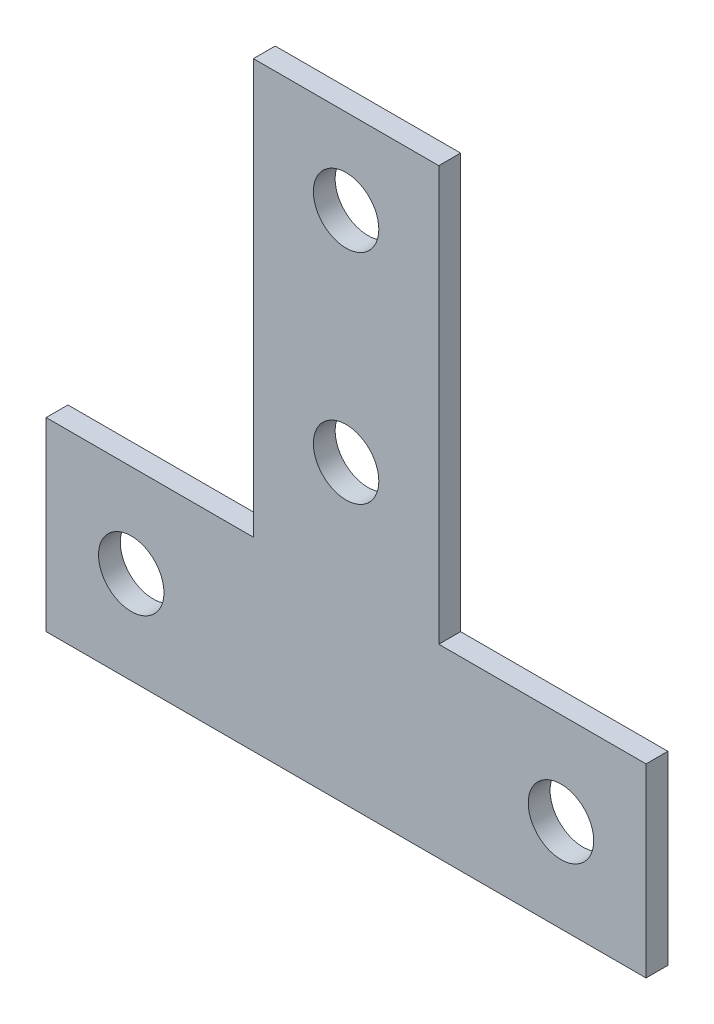
ISO-10303-21;
HEADER;
FILE_DESCRIPTION(('STEP AP214'),'2;1');
FILE_NAME('part.step','',(''),(''),'','','');
FILE_SCHEMA(('AUTOMOTIVE_DESIGN { 1 0 10303 214 1 1 1 1 }'));
ENDSEC;
DATA;
#1=APPLICATION_CONTEXT('core data for automotive mechanical design processes');
#2=APPLICATION_PROTOCOL_DEFINITION('international standard','automotive_design',2000,#1);
#3=PRODUCT_CONTEXT('',#1,'mechanical');
#4=PRODUCT('Part','Part','',(#3));
#5=PRODUCT_RELATED_PRODUCT_CATEGORY('part','',(#4));
#6=PRODUCT_DEFINITION_FORMATION('','',#4);
#7=PRODUCT_DEFINITION_CONTEXT('part definition',#1,'design');
#8=PRODUCT_DEFINITION('design','',#6,#7);
#9=PRODUCT_DEFINITION_SHAPE('','',#8);
#10=(LENGTH_UNIT() NAMED_UNIT(*) SI_UNIT(.MILLI.,.METRE.));
#11=(NAMED_UNIT(*) PLANE_ANGLE_UNIT() SI_UNIT($,.RADIAN.));
#12=(NAMED_UNIT(*) SI_UNIT($,.STERADIAN.) SOLID_ANGLE_UNIT());
#13=UNCERTAINTY_MEASURE_WITH_UNIT(LENGTH_MEASURE(1.E-05),#10,'distance_accuracy_value','');
#14=(GEOMETRIC_REPRESENTATION_CONTEXT(3) GLOBAL_UNCERTAINTY_ASSIGNED_CONTEXT((#13)) GLOBAL_UNIT_ASSIGNED_CONTEXT((#10,
#11,#12)) REPRESENTATION_CONTEXT('',''));
#15=CARTESIAN_POINT('',(0.,0.,0.));
#16=DIRECTION('',(0.,0.,1.));
#17=DIRECTION('',(1.,0.,0.));
#18=AXIS2_PLACEMENT_3D('',#15,#16,#17);
#19=CARTESIAN_POINT('',(8.5,8.5,2.));
#20=DIRECTION('',(0.,-1.,0.));
#21=DIRECTION('',(0.,0.,-1.));
#22=AXIS2_PLACEMENT_3D('',#19,#20,#21);
#23=PLANE('',#22);
#24=DIRECTION('',(-1.,0.,0.));
#25=VECTOR('',#24,1.);
#26=CARTESIAN_POINT('',(8.5,8.5,0.));
#27=LINE('',#26,#25);
#28=CARTESIAN_POINT('',(27.5,8.5,0.));
#29=VERTEX_POINT('',#28);
#30=CARTESIAN_POINT('',(8.5,8.5,0.));
#31=VERTEX_POINT('',#30);
#32=EDGE_CURVE('E129',#29,#31,#27,.T.);
#33=ORIENTED_EDGE('',*,*,#32,.T.);
#34=DIRECTION('',(0.,0.,-1.));
#35=VECTOR('',#34,1.);
#36=CARTESIAN_POINT('',(8.5,8.5,2.));
#37=LINE('',#36,#35);
#38=CARTESIAN_POINT('',(8.5,8.5,2.));
#39=VERTEX_POINT('',#38);
#40=EDGE_CURVE('E11',#39,#31,#37,.T.);
#41=ORIENTED_EDGE('',*,*,#40,.F.);
#42=DIRECTION('',(-1.,0.,0.));
#43=VECTOR('',#42,1.);
#44=CARTESIAN_POINT('',(8.5,8.5,2.));
#45=LINE('',#44,#43);
#46=CARTESIAN_POINT('',(27.5,8.5,2.));
#47=VERTEX_POINT('',#46);
#48=EDGE_CURVE('E144',#47,#39,#45,.T.);
#49=ORIENTED_EDGE('',*,*,#48,.F.);
#50=DIRECTION('',(0.,0.,-1.));
#51=VECTOR('',#50,1.);
#52=CARTESIAN_POINT('',(27.5,8.5,2.));
#53=LINE('',#52,#51);
#54=EDGE_CURVE('E125',#47,#29,#53,.T.);
#55=ORIENTED_EDGE('',*,*,#54,.T.);
#56=EDGE_LOOP('',(#33,#41,#49,#55));
#57=FACE_BOUND('',#56,.T.);
#58=ADVANCED_FACE('F33',(#57),#23,.F.);
#59=CARTESIAN_POINT('',(8.5,8.5,2.));
#60=DIRECTION('',(-1.,0.,0.));
#61=DIRECTION('',(0.,0.,1.));
#62=AXIS2_PLACEMENT_3D('',#59,#60,#61);
#63=PLANE('',#62);
#64=DIRECTION('',(0.,1.,0.));
#65=VECTOR('',#64,1.);
#66=CARTESIAN_POINT('',(8.5,8.5,0.));
#67=LINE('',#66,#65);
#68=CARTESIAN_POINT('',(8.5,46.5,0.));
#69=VERTEX_POINT('',#68);
#70=EDGE_CURVE('E132',#31,#69,#67,.T.);
#71=ORIENTED_EDGE('',*,*,#70,.T.);
#72=DIRECTION('',(0.,0.,-1.));
#73=VECTOR('',#72,1.);
#74=CARTESIAN_POINT('',(8.5,46.5,2.));
#75=LINE('',#74,#73);
#76=CARTESIAN_POINT('',(8.5,46.5,2.));
#77=VERTEX_POINT('',#76);
#78=EDGE_CURVE('E41',#77,#69,#75,.T.);
#79=ORIENTED_EDGE('',*,*,#78,.F.);
#80=DIRECTION('',(0.,1.,0.));
#81=VECTOR('',#80,1.);
#82=CARTESIAN_POINT('',(8.5,8.5,2.));
#83=LINE('',#82,#81);
#84=EDGE_CURVE('E92',#39,#77,#83,.T.);
#85=ORIENTED_EDGE('',*,*,#84,.F.);
#86=ORIENTED_EDGE('',*,*,#40,.T.);
#87=EDGE_LOOP('',(#71,#79,#85,#86));
#88=FACE_BOUND('',#87,.T.);
#89=ADVANCED_FACE('F234',(#88),#63,.F.);
#90=CARTESIAN_POINT('',(-8.5,46.5,2.));
#91=DIRECTION('',(0.,-1.,0.));
#92=DIRECTION('',(0.,0.,-1.));
#93=AXIS2_PLACEMENT_3D('',#90,#91,#92);
#94=PLANE('',#93);
#95=DIRECTION('',(-1.,0.,0.));
#96=VECTOR('',#95,1.);
#97=CARTESIAN_POINT('',(-8.5,46.5,0.));
#98=LINE('',#97,#96);
#99=CARTESIAN_POINT('',(-8.5,46.5,0.));
#100=VERTEX_POINT('',#99);
#101=EDGE_CURVE('E135',#69,#100,#98,.T.);
#102=ORIENTED_EDGE('',*,*,#101,.T.);
#103=DIRECTION('',(0.,0.,-1.));
#104=VECTOR('',#103,1.);
#105=CARTESIAN_POINT('',(-8.5,46.5,2.));
#106=LINE('',#105,#104);
#107=CARTESIAN_POINT('',(-8.5,46.5,2.));
#108=VERTEX_POINT('',#107);
#109=EDGE_CURVE('E151',#108,#100,#106,.T.);
#110=ORIENTED_EDGE('',*,*,#109,.F.);
#111=DIRECTION('',(-1.,0.,0.));
#112=VECTOR('',#111,1.);
#113=CARTESIAN_POINT('',(-8.5,46.5,2.));
#114=LINE('',#113,#112);
#115=EDGE_CURVE('E159',#77,#108,#114,.T.);
#116=ORIENTED_EDGE('',*,*,#115,.F.);
#117=ORIENTED_EDGE('',*,*,#78,.T.);
#118=EDGE_LOOP('',(#102,#110,#116,#117));
#119=FACE_BOUND('',#118,.T.);
#120=ADVANCED_FACE('F157',(#119),#94,.F.);
#121=CARTESIAN_POINT('',(-8.5,8.5,2.));
#122=DIRECTION('',(1.,0.,0.));
#123=DIRECTION('',(0.,0.,-1.));
#124=AXIS2_PLACEMENT_3D('',#121,#122,#123);
#125=PLANE('',#124);
#126=DIRECTION('',(0.,-1.,0.));
#127=VECTOR('',#126,1.);
#128=CARTESIAN_POINT('',(-8.5,8.5,0.));
#129=LINE('',#128,#127);
#130=CARTESIAN_POINT('',(-8.5,8.5,0.));
#131=VERTEX_POINT('',#130);
#132=EDGE_CURVE('E137',#100,#131,#129,.T.);
#133=ORIENTED_EDGE('',*,*,#132,.T.);
#134=DIRECTION('',(0.,0.,-1.));
#135=VECTOR('',#134,1.);
#136=CARTESIAN_POINT('',(-8.5,8.5,2.));
#137=LINE('',#136,#135);
#138=CARTESIAN_POINT('',(-8.5,8.5,2.));
#139=VERTEX_POINT('',#138);
#140=EDGE_CURVE('E148',#139,#131,#137,.T.);
#141=ORIENTED_EDGE('',*,*,#140,.F.);
#142=DIRECTION('',(0.,-1.,0.));
#143=VECTOR('',#142,1.);
#144=CARTESIAN_POINT('',(-8.5,8.5,2.));
#145=LINE('',#144,#143);
#146=EDGE_CURVE('E171',#108,#139,#145,.T.);
#147=ORIENTED_EDGE('',*,*,#146,.F.);
#148=ORIENTED_EDGE('',*,*,#109,.T.);
#149=EDGE_LOOP('',(#133,#141,#147,#148));
#150=FACE_BOUND('',#149,.T.);
#151=ADVANCED_FACE('F167',(#150),#125,.F.);
#152=CARTESIAN_POINT('',(-27.5,8.5,2.));
#153=DIRECTION('',(0.,-1.,0.));
#154=DIRECTION('',(0.,0.,-1.));
#155=AXIS2_PLACEMENT_3D('',#152,#153,#154);
#156=PLANE('',#155);
#157=DIRECTION('',(-1.,0.,0.));
#158=VECTOR('',#157,1.);
#159=CARTESIAN_POINT('',(-27.5,8.5,0.));
#160=LINE('',#159,#158);
#161=CARTESIAN_POINT('',(-27.5,8.5,0.));
#162=VERTEX_POINT('',#161);
#163=EDGE_CURVE('E139',#131,#162,#160,.T.);
#164=ORIENTED_EDGE('',*,*,#163,.T.);
#165=DIRECTION('',(0.,0.,-1.));
#166=VECTOR('',#165,1.);
#167=CARTESIAN_POINT('',(-27.5,8.5,2.));
#168=LINE('',#167,#166);
#169=CARTESIAN_POINT('',(-27.5,8.5,2.));
#170=VERTEX_POINT('',#169);
#171=EDGE_CURVE('E120',#170,#162,#168,.T.);
#172=ORIENTED_EDGE('',*,*,#171,.F.);
#173=DIRECTION('',(-1.,0.,0.));
#174=VECTOR('',#173,1.);
#175=CARTESIAN_POINT('',(-27.5,8.5,2.));
#176=LINE('',#175,#174);
#177=EDGE_CURVE('E111',#139,#170,#176,.T.);
#178=ORIENTED_EDGE('',*,*,#177,.F.);
#179=ORIENTED_EDGE('',*,*,#140,.T.);
#180=EDGE_LOOP('',(#164,#172,#178,#179));
#181=FACE_BOUND('',#180,.T.);
#182=ADVANCED_FACE('F170',(#181),#156,.F.);
#183=CARTESIAN_POINT('',(-27.5,-8.5,2.));
#184=DIRECTION('',(1.,0.,0.));
#185=DIRECTION('',(0.,0.,-1.));
#186=AXIS2_PLACEMENT_3D('',#183,#184,#185);
#187=PLANE('',#186);
#188=DIRECTION('',(0.,-1.,0.));
#189=VECTOR('',#188,1.);
#190=CARTESIAN_POINT('',(-27.5,-8.5,0.));
#191=LINE('',#190,#189);
#192=CARTESIAN_POINT('',(-27.5,-8.5,0.));
#193=VERTEX_POINT('',#192);
#194=EDGE_CURVE('E119',#162,#193,#191,.T.);
#195=ORIENTED_EDGE('',*,*,#194,.T.);
#196=DIRECTION('',(0.,0.,-1.));
#197=VECTOR('',#196,1.);
#198=CARTESIAN_POINT('',(-27.5,-8.5,2.));
#199=LINE('',#198,#197);
#200=CARTESIAN_POINT('',(-27.5,-8.5,2.));
#201=VERTEX_POINT('',#200);
#202=EDGE_CURVE('E116',#201,#193,#199,.T.);
#203=ORIENTED_EDGE('',*,*,#202,.F.);
#204=DIRECTION('',(0.,-1.,0.));
#205=VECTOR('',#204,1.);
#206=CARTESIAN_POINT('',(-27.5,-8.5,2.));
#207=LINE('',#206,#205);
#208=EDGE_CURVE('E105',#170,#201,#207,.T.);
#209=ORIENTED_EDGE('',*,*,#208,.F.);
#210=ORIENTED_EDGE('',*,*,#171,.T.);
#211=EDGE_LOOP('',(#195,#203,#209,#210));
#212=FACE_BOUND('',#211,.T.);
#213=ADVANCED_FACE('F117',(#212),#187,.F.);
#214=CARTESIAN_POINT('',(-27.5,-8.5,2.));
#215=DIRECTION('',(0.,1.,0.));
#216=DIRECTION('',(0.,0.,1.));
#217=AXIS2_PLACEMENT_3D('',#214,#215,#216);
#218=PLANE('',#217);
#219=DIRECTION('',(1.,0.,0.));
#220=VECTOR('',#219,1.);
#221=CARTESIAN_POINT('',(-27.5,-8.5,0.));
#222=LINE('',#221,#220);
#223=CARTESIAN_POINT('',(27.5,-8.5,0.));
#224=VERTEX_POINT('',#223);
#225=EDGE_CURVE('E78',#193,#224,#222,.T.);
#226=ORIENTED_EDGE('',*,*,#225,.T.);
#227=DIRECTION('',(0.,0.,-1.));
#228=VECTOR('',#227,1.);
#229=CARTESIAN_POINT('',(27.5,-8.5,2.));
#230=LINE('',#229,#228);
#231=CARTESIAN_POINT('',(27.5,-8.5,2.));
#232=VERTEX_POINT('',#231);
#233=EDGE_CURVE('E121',#232,#224,#230,.T.);
#234=ORIENTED_EDGE('',*,*,#233,.F.);
#235=DIRECTION('',(1.,0.,0.));
#236=VECTOR('',#235,1.);
#237=CARTESIAN_POINT('',(-27.5,-8.5,2.));
#238=LINE('',#237,#236);
#239=EDGE_CURVE('E109',#201,#232,#238,.T.);
#240=ORIENTED_EDGE('',*,*,#239,.F.);
#241=ORIENTED_EDGE('',*,*,#202,.T.);
#242=EDGE_LOOP('',(#226,#234,#240,#241));
#243=FACE_BOUND('',#242,.T.);
#244=ADVANCED_FACE('F123',(#243),#218,.F.);
#245=CARTESIAN_POINT('',(27.5,-8.5,2.));
#246=DIRECTION('',(-1.,0.,0.));
#247=DIRECTION('',(0.,0.,1.));
#248=AXIS2_PLACEMENT_3D('',#245,#246,#247);
#249=PLANE('',#248);
#250=DIRECTION('',(0.,1.,0.));
#251=VECTOR('',#250,1.);
#252=CARTESIAN_POINT('',(27.5,-8.5,0.));
#253=LINE('',#252,#251);
#254=EDGE_CURVE('E84',#224,#29,#253,.T.);
#255=ORIENTED_EDGE('',*,*,#254,.T.);
#256=ORIENTED_EDGE('',*,*,#54,.F.);
#257=DIRECTION('',(0.,1.,0.));
#258=VECTOR('',#257,1.);
#259=CARTESIAN_POINT('',(27.5,-8.5,2.));
#260=LINE('',#259,#258);
#261=EDGE_CURVE('E49',#232,#47,#260,.T.);
#262=ORIENTED_EDGE('',*,*,#261,.F.);
#263=ORIENTED_EDGE('',*,*,#233,.T.);
#264=EDGE_LOOP('',(#255,#256,#262,#263));
#265=FACE_BOUND('',#264,.T.);
#266=ADVANCED_FACE('F212',(#265),#249,.F.);
#267=CARTESIAN_POINT('',(27.5,8.5,2.));
#268=DIRECTION('',(0.,0.,1.));
#269=DIRECTION('',(1.,0.,0.));
#270=AXIS2_PLACEMENT_3D('',#267,#268,#269);
#271=PLANE('',#270);
#272=CARTESIAN_POINT('',(19.7,0.,2.));
#273=DIRECTION('',(0.,0.,1.));
#274=DIRECTION('',(-1.,0.,0.));
#275=AXIS2_PLACEMENT_3D('',#272,#273,#274);
#276=CIRCLE('',#275,3.);
#277=CARTESIAN_POINT('',(16.7,0.,2.));
#278=VERTEX_POINT('',#277);
#279=EDGE_CURVE('E195',#278,#278,#276,.T.);
#280=ORIENTED_EDGE('',*,*,#279,.F.);
#281=EDGE_LOOP('',(#280));
#282=FACE_BOUND('',#281,.T.);
#283=CARTESIAN_POINT('',(-19.7,0.,2.));
#284=DIRECTION('',(0.,0.,1.));
#285=DIRECTION('',(1.,0.,0.));
#286=AXIS2_PLACEMENT_3D('',#283,#284,#285);
#287=CIRCLE('',#286,3.);
#288=CARTESIAN_POINT('',(-16.7,0.,2.));
#289=VERTEX_POINT('',#288);
#290=EDGE_CURVE('E189',#289,#289,#287,.T.);
#291=ORIENTED_EDGE('',*,*,#290,.F.);
#292=EDGE_LOOP('',(#291));
#293=FACE_BOUND('',#292,.T.);
#294=CARTESIAN_POINT('',(0.,18.7,2.));
#295=DIRECTION('',(0.,0.,1.));
#296=DIRECTION('',(1.,0.,0.));
#297=AXIS2_PLACEMENT_3D('',#294,#295,#296);
#298=CIRCLE('',#297,3.);
#299=CARTESIAN_POINT('',(3.,18.7,2.));
#300=VERTEX_POINT('',#299);
#301=EDGE_CURVE('E183',#300,#300,#298,.T.);
#302=ORIENTED_EDGE('',*,*,#301,.F.);
#303=EDGE_LOOP('',(#302));
#304=FACE_BOUND('',#303,.T.);
#305=CARTESIAN_POINT('',(0.,38.7,2.));
#306=DIRECTION('',(0.,0.,1.));
#307=DIRECTION('',(1.,0.,0.));
#308=AXIS2_PLACEMENT_3D('',#305,#306,#307);
#309=CIRCLE('',#308,3.);
#310=CARTESIAN_POINT('',(3.,38.7,2.));
#311=VERTEX_POINT('',#310);
#312=EDGE_CURVE('E177',#311,#311,#309,.T.);
#313=ORIENTED_EDGE('',*,*,#312,.F.);
#314=EDGE_LOOP('',(#313));
#315=FACE_BOUND('',#314,.T.);
#316=ORIENTED_EDGE('',*,*,#48,.T.);
#317=ORIENTED_EDGE('',*,*,#84,.T.);
#318=ORIENTED_EDGE('',*,*,#115,.T.);
#319=ORIENTED_EDGE('',*,*,#146,.T.);
#320=ORIENTED_EDGE('',*,*,#177,.T.);
#321=ORIENTED_EDGE('',*,*,#208,.T.);
#322=ORIENTED_EDGE('',*,*,#239,.T.);
#323=ORIENTED_EDGE('',*,*,#261,.T.);
#324=EDGE_LOOP('',(#316,#317,#318,#319,#320,#321,#322,#323));
#325=FACE_BOUND('',#324,.T.);
#326=ADVANCED_FACE('F107',(#282,#293,#304,#315,#325),#271,.T.);
#327=CARTESIAN_POINT('',(27.5,8.5,0.));
#328=DIRECTION('',(0.,0.,1.));
#329=DIRECTION('',(1.,0.,0.));
#330=AXIS2_PLACEMENT_3D('',#327,#328,#329);
#331=PLANE('',#330);
#332=CARTESIAN_POINT('',(19.7,0.,0.));
#333=DIRECTION('',(0.,0.,1.));
#334=DIRECTION('',(-1.,0.,0.));
#335=AXIS2_PLACEMENT_3D('',#332,#333,#334);
#336=CIRCLE('',#335,3.);
#337=CARTESIAN_POINT('',(16.7,0.,0.));
#338=VERTEX_POINT('',#337);
#339=EDGE_CURVE('E192',#338,#338,#336,.T.);
#340=ORIENTED_EDGE('',*,*,#339,.T.);
#341=EDGE_LOOP('',(#340));
#342=FACE_BOUND('',#341,.T.);
#343=CARTESIAN_POINT('',(-19.7,0.,0.));
#344=DIRECTION('',(0.,0.,1.));
#345=DIRECTION('',(1.,0.,0.));
#346=AXIS2_PLACEMENT_3D('',#343,#344,#345);
#347=CIRCLE('',#346,3.);
#348=CARTESIAN_POINT('',(-16.7,0.,0.));
#349=VERTEX_POINT('',#348);
#350=EDGE_CURVE('E186',#349,#349,#347,.T.);
#351=ORIENTED_EDGE('',*,*,#350,.T.);
#352=EDGE_LOOP('',(#351));
#353=FACE_BOUND('',#352,.T.);
#354=CARTESIAN_POINT('',(0.,18.7,0.));
#355=DIRECTION('',(0.,0.,1.));
#356=DIRECTION('',(1.,0.,0.));
#357=AXIS2_PLACEMENT_3D('',#354,#355,#356);
#358=CIRCLE('',#357,3.);
#359=CARTESIAN_POINT('',(3.,18.7,0.));
#360=VERTEX_POINT('',#359);
#361=EDGE_CURVE('E180',#360,#360,#358,.T.);
#362=ORIENTED_EDGE('',*,*,#361,.T.);
#363=EDGE_LOOP('',(#362));
#364=FACE_BOUND('',#363,.T.);
#365=CARTESIAN_POINT('',(0.,38.7,0.));
#366=DIRECTION('',(0.,0.,1.));
#367=DIRECTION('',(1.,0.,0.));
#368=AXIS2_PLACEMENT_3D('',#365,#366,#367);
#369=CIRCLE('',#368,3.);
#370=CARTESIAN_POINT('',(3.,38.7,0.));
#371=VERTEX_POINT('',#370);
#372=EDGE_CURVE('E133',#371,#371,#369,.T.);
#373=ORIENTED_EDGE('',*,*,#372,.T.);
#374=EDGE_LOOP('',(#373));
#375=FACE_BOUND('',#374,.T.);
#376=ORIENTED_EDGE('',*,*,#32,.F.);
#377=ORIENTED_EDGE('',*,*,#254,.F.);
#378=ORIENTED_EDGE('',*,*,#225,.F.);
#379=ORIENTED_EDGE('',*,*,#194,.F.);
#380=ORIENTED_EDGE('',*,*,#163,.F.);
#381=ORIENTED_EDGE('',*,*,#132,.F.);
#382=ORIENTED_EDGE('',*,*,#101,.F.);
#383=ORIENTED_EDGE('',*,*,#70,.F.);
#384=EDGE_LOOP('',(#376,#377,#378,#379,#380,#381,#382,#383));
#385=FACE_BOUND('',#384,.T.);
#386=ADVANCED_FACE('F163',(#342,#353,#364,#375,#385),#331,.F.);
#387=CARTESIAN_POINT('',(0.,38.7,0.));
#388=DIRECTION('',(0.,0.,1.));
#389=DIRECTION('',(1.,0.,0.));
#390=AXIS2_PLACEMENT_3D('',#387,#388,#389);
#391=CYLINDRICAL_SURFACE('',#390,3.);
#392=ORIENTED_EDGE('',*,*,#372,.F.);
#393=EDGE_LOOP('',(#392));
#394=FACE_BOUND('',#393,.T.);
#395=ORIENTED_EDGE('',*,*,#312,.T.);
#396=EDGE_LOOP('',(#395));
#397=FACE_BOUND('',#396,.T.);
#398=ADVANCED_FACE('F220',(#394,#397),#391,.F.);
#399=CARTESIAN_POINT('',(0.,18.7,0.));
#400=DIRECTION('',(0.,0.,1.));
#401=DIRECTION('',(1.,0.,0.));
#402=AXIS2_PLACEMENT_3D('',#399,#400,#401);
#403=CYLINDRICAL_SURFACE('',#402,3.);
#404=ORIENTED_EDGE('',*,*,#361,.F.);
#405=EDGE_LOOP('',(#404));
#406=FACE_BOUND('',#405,.T.);
#407=ORIENTED_EDGE('',*,*,#301,.T.);
#408=EDGE_LOOP('',(#407));
#409=FACE_BOUND('',#408,.T.);
#410=ADVANCED_FACE('F222',(#406,#409),#403,.F.);
#411=CARTESIAN_POINT('',(-19.7,0.,0.));
#412=DIRECTION('',(0.,0.,1.));
#413=DIRECTION('',(1.,0.,0.));
#414=AXIS2_PLACEMENT_3D('',#411,#412,#413);
#415=CYLINDRICAL_SURFACE('',#414,3.);
#416=ORIENTED_EDGE('',*,*,#350,.F.);
#417=EDGE_LOOP('',(#416));
#418=FACE_BOUND('',#417,.T.);
#419=ORIENTED_EDGE('',*,*,#290,.T.);
#420=EDGE_LOOP('',(#419));
#421=FACE_BOUND('',#420,.T.);
#422=ADVANCED_FACE('F206',(#418,#421),#415,.F.);
#423=CARTESIAN_POINT('',(19.7,0.,0.));
#424=DIRECTION('',(0.,0.,1.));
#425=DIRECTION('',(1.,0.,0.));
#426=AXIS2_PLACEMENT_3D('',#423,#424,#425);
#427=CYLINDRICAL_SURFACE('',#426,3.);
#428=ORIENTED_EDGE('',*,*,#339,.F.);
#429=EDGE_LOOP('',(#428));
#430=FACE_BOUND('',#429,.T.);
#431=ORIENTED_EDGE('',*,*,#279,.T.);
#432=EDGE_LOOP('',(#431));
#433=FACE_BOUND('',#432,.T.);
#434=ADVANCED_FACE('F203',(#430,#433),#427,.F.);
#435=CLOSED_SHELL('',(#58,#89,#120,#151,#182,#213,#244,#266,#326,#386,#398,#410,#422,#434));
#436=MANIFOLD_SOLID_BREP('B2',#435);
#437=ADVANCED_BREP_SHAPE_REPRESENTATION('',(#18,#436),#14);
#438=SHAPE_DEFINITION_REPRESENTATION(#9,#437);
ENDSEC;
END-ISO-10303-21;
